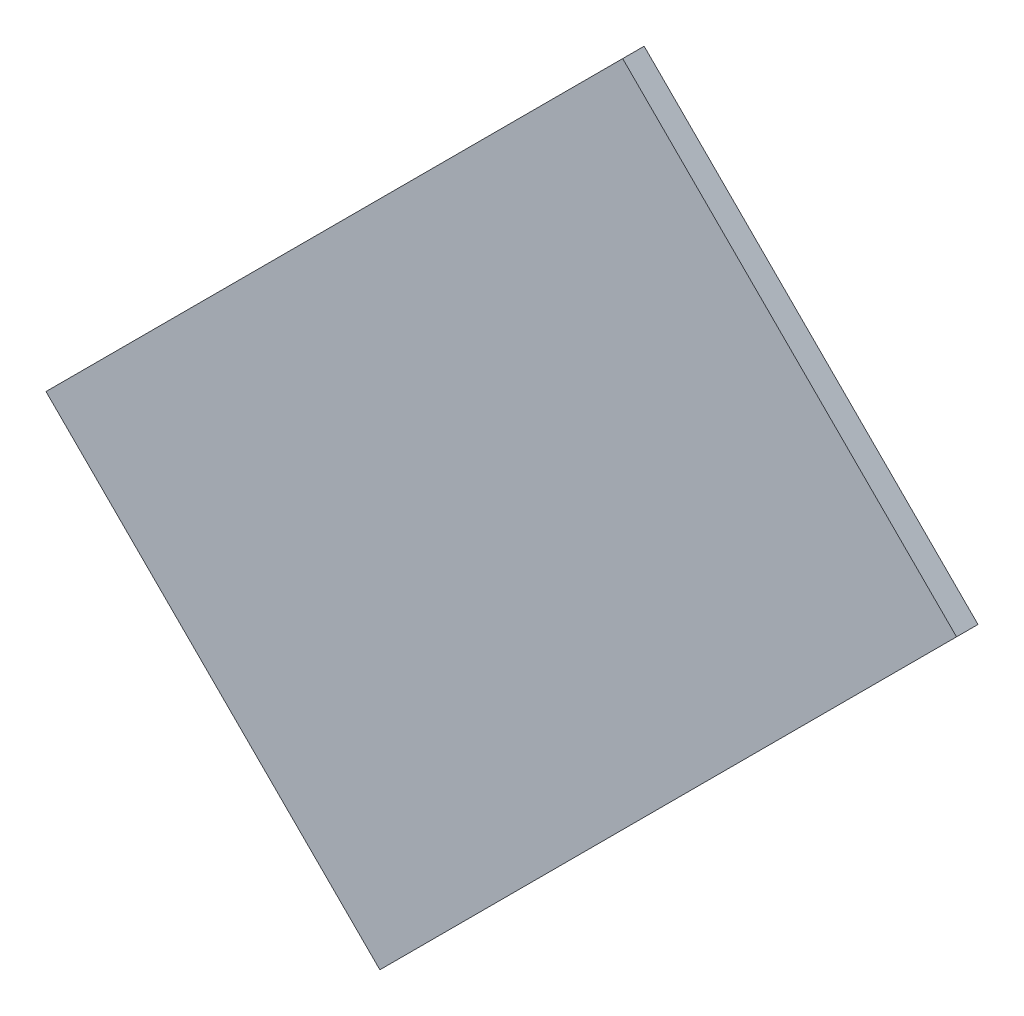
ISO-10303-21;
HEADER;
FILE_DESCRIPTION(('STEP AP214'),'2;1');
FILE_NAME('part.step','',(''),(''),'','','');
FILE_SCHEMA(('AUTOMOTIVE_DESIGN { 1 0 10303 214 1 1 1 1 }'));
ENDSEC;
DATA;
#1=APPLICATION_CONTEXT('core data for automotive mechanical design processes');
#2=APPLICATION_PROTOCOL_DEFINITION('international standard','automotive_design',2000,#1);
#3=PRODUCT_CONTEXT('',#1,'mechanical');
#4=PRODUCT('Part','Part','',(#3));
#5=PRODUCT_RELATED_PRODUCT_CATEGORY('part','',(#4));
#6=PRODUCT_DEFINITION_FORMATION('','',#4);
#7=PRODUCT_DEFINITION_CONTEXT('part definition',#1,'design');
#8=PRODUCT_DEFINITION('design','',#6,#7);
#9=PRODUCT_DEFINITION_SHAPE('','',#8);
#10=(LENGTH_UNIT() NAMED_UNIT(*) SI_UNIT(.MILLI.,.METRE.));
#11=(NAMED_UNIT(*) PLANE_ANGLE_UNIT() SI_UNIT($,.RADIAN.));
#12=(NAMED_UNIT(*) SI_UNIT($,.STERADIAN.) SOLID_ANGLE_UNIT());
#13=UNCERTAINTY_MEASURE_WITH_UNIT(LENGTH_MEASURE(1.E-05),#10,'distance_accuracy_value','');
#14=(GEOMETRIC_REPRESENTATION_CONTEXT(3) GLOBAL_UNCERTAINTY_ASSIGNED_CONTEXT((#13)) GLOBAL_UNIT_ASSIGNED_CONTEXT((#10,
#11,#12)) REPRESENTATION_CONTEXT('',''));
#15=CARTESIAN_POINT('',(0.,0.,0.));
#16=DIRECTION('',(0.,0.,1.));
#17=DIRECTION('',(1.,0.,0.));
#18=AXIS2_PLACEMENT_3D('',#15,#16,#17);
#19=CARTESIAN_POINT('',(3.53553390600398,704.808671689089,-336.857743681072));
#20=DIRECTION('',(0.,0.,1.));
#21=DIRECTION('',(1.,0.,0.));
#22=AXIS2_PLACEMENT_3D('',#19,#20,#21);
#23=PLANE('',#22);
#24=DIRECTION('',(0.707106781187497,0.707106781185598,0.));
#25=VECTOR('',#24,1.);
#26=CARTESIAN_POINT('',(-17.6776695296571,656.725410568432,-336.857743681072));
#27=LINE('',#26,#25);
#28=CARTESIAN_POINT('',(-17.6776695296571,656.725410568432,-336.857743681072));
#29=VERTEX_POINT('',#28);
#30=CARTESIAN_POINT('',(9.19238815546803,683.595468253485,-336.857743681072));
#31=VERTEX_POINT('',#30);
#32=EDGE_CURVE('E79',#29,#31,#27,.T.);
#33=ORIENTED_EDGE('',*,*,#32,.T.);
#34=DIRECTION('',(0.707106781185597,-0.707106781187498,0.));
#35=VECTOR('',#34,1.);
#36=CARTESIAN_POINT('',(9.19238815546795,683.595468253485,-336.857743681072));
#37=LINE('',#36,#35);
#38=CARTESIAN_POINT('',(24.748737341551,668.03911906736,-336.857743681072));
#39=VERTEX_POINT('',#38);
#40=EDGE_CURVE('E55',#31,#39,#37,.T.);
#41=ORIENTED_EDGE('',*,*,#40,.T.);
#42=DIRECTION('',(-0.707106781187499,-0.707106781185596,0.));
#43=VECTOR('',#42,1.);
#44=CARTESIAN_POINT('',(-2.12132034357409,641.169061382308,-336.857743681072));
#45=LINE('',#44,#43);
#46=CARTESIAN_POINT('',(-2.1213203435742,641.169061382308,-336.857743681072));
#47=VERTEX_POINT('',#46);
#48=EDGE_CURVE('E57',#39,#47,#45,.T.);
#49=ORIENTED_EDGE('',*,*,#48,.T.);
#50=DIRECTION('',(-0.707106781185598,0.707106781187497,0.));
#51=VECTOR('',#50,1.);
#52=CARTESIAN_POINT('',(-17.6776695296571,656.725410568432,-336.857743681072));
#53=LINE('',#52,#51);
#54=EDGE_CURVE('E20',#47,#29,#53,.T.);
#55=ORIENTED_EDGE('',*,*,#54,.T.);
#56=EDGE_LOOP('',(#33,#41,#49,#55));
#57=FACE_BOUND('',#56,.T.);
#58=ADVANCED_FACE('F17',(#57),#23,.F.);
#59=CARTESIAN_POINT('',(-17.6776695296571,656.725410568432,-336.857743681072));
#60=DIRECTION('',(0.707106781187497,0.707106781185598,0.));
#61=DIRECTION('',(-0.707106781185598,0.707106781187497,0.));
#62=AXIS2_PLACEMENT_3D('',#59,#60,#61);
#63=PLANE('',#62);
#64=DIRECTION('',(0.707106781185615,-0.70710678118748,0.));
#65=VECTOR('',#64,1.);
#66=CARTESIAN_POINT('',(-17.6776695296571,656.725410568432,-335.857743681072));
#67=LINE('',#66,#65);
#68=CARTESIAN_POINT('',(-17.6776695296571,656.725410568432,-335.857743681072));
#69=VERTEX_POINT('',#68);
#70=CARTESIAN_POINT('',(-2.1213203435743,641.169061382308,-335.857743681072));
#71=VERTEX_POINT('',#70);
#72=EDGE_CURVE('E83',#69,#71,#67,.T.);
#73=ORIENTED_EDGE('',*,*,#72,.F.);
#74=DIRECTION('',(0.,0.,1.));
#75=VECTOR('',#74,1.);
#76=CARTESIAN_POINT('',(-17.6776695296571,656.725410568432,-335.857743681072));
#77=LINE('',#76,#75);
#78=EDGE_CURVE('E68',#69,#29,#77,.F.);
#79=ORIENTED_EDGE('',*,*,#78,.T.);
#80=ORIENTED_EDGE('',*,*,#54,.F.);
#81=DIRECTION('',(0.,0.,1.));
#82=VECTOR('',#81,1.);
#83=CARTESIAN_POINT('',(-2.12132034357409,641.169061382308,-336.857743681072));
#84=LINE('',#83,#82);
#85=EDGE_CURVE('E63',#47,#71,#84,.T.);
#86=ORIENTED_EDGE('',*,*,#85,.T.);
#87=EDGE_LOOP('',(#73,#79,#80,#86));
#88=FACE_BOUND('',#87,.T.);
#89=ADVANCED_FACE('F65',(#88),#63,.F.);
#90=CARTESIAN_POINT('',(-2.12132034357409,641.169061382308,-336.857743681072));
#91=DIRECTION('',(-0.707106781185596,0.707106781187499,0.));
#92=DIRECTION('',(-0.707106781187499,-0.707106781185596,0.));
#93=AXIS2_PLACEMENT_3D('',#90,#91,#92);
#94=PLANE('',#93);
#95=DIRECTION('',(0.70710678118751,0.707106781185585,0.));
#96=VECTOR('',#95,1.);
#97=CARTESIAN_POINT('',(-2.1213203435741,641.169061382308,-335.857743681072));
#98=LINE('',#97,#96);
#99=CARTESIAN_POINT('',(24.7487373415509,668.03911906736,-335.857743681072));
#100=VERTEX_POINT('',#99);
#101=EDGE_CURVE('E72',#71,#100,#98,.T.);
#102=ORIENTED_EDGE('',*,*,#101,.F.);
#103=ORIENTED_EDGE('',*,*,#85,.F.);
#104=ORIENTED_EDGE('',*,*,#48,.F.);
#105=DIRECTION('',(0.,0.,1.));
#106=VECTOR('',#105,1.);
#107=CARTESIAN_POINT('',(24.7487373415511,668.03911906736,-335.857743681072));
#108=LINE('',#107,#106);
#109=EDGE_CURVE('E75',#39,#100,#108,.T.);
#110=ORIENTED_EDGE('',*,*,#109,.T.);
#111=EDGE_LOOP('',(#102,#103,#104,#110));
#112=FACE_BOUND('',#111,.T.);
#113=ADVANCED_FACE('F70',(#112),#94,.F.);
#114=CARTESIAN_POINT('',(9.19238815546795,683.595468253485,-335.857743681072));
#115=DIRECTION('',(-0.707106781187498,-0.707106781185597,0.));
#116=DIRECTION('',(0.707106781185597,-0.707106781187498,0.));
#117=AXIS2_PLACEMENT_3D('',#114,#115,#116);
#118=PLANE('',#117);
#119=DIRECTION('',(-0.707106781185593,0.707106781187502,0.));
#120=VECTOR('',#119,1.);
#121=CARTESIAN_POINT('',(24.7487373415511,668.03911906736,-335.857743681072));
#122=LINE('',#121,#120);
#123=CARTESIAN_POINT('',(9.19238815546801,683.595468253485,-335.857743681072));
#124=VERTEX_POINT('',#123);
#125=EDGE_CURVE('E26',#100,#124,#122,.T.);
#126=ORIENTED_EDGE('',*,*,#125,.F.);
#127=ORIENTED_EDGE('',*,*,#109,.F.);
#128=ORIENTED_EDGE('',*,*,#40,.F.);
#129=DIRECTION('',(0.,0.,1.));
#130=VECTOR('',#129,1.);
#131=CARTESIAN_POINT('',(9.19238815546807,683.595468253485,-335.857743681072));
#132=LINE('',#131,#130);
#133=EDGE_CURVE('E35',#31,#124,#132,.T.);
#134=ORIENTED_EDGE('',*,*,#133,.T.);
#135=EDGE_LOOP('',(#126,#127,#128,#134));
#136=FACE_BOUND('',#135,.T.);
#137=ADVANCED_FACE('F89',(#136),#118,.F.);
#138=CARTESIAN_POINT('',(-17.6776695296571,656.725410568432,-335.857743681072));
#139=DIRECTION('',(0.707106781185598,-0.707106781187497,0.));
#140=DIRECTION('',(0.707106781187497,0.707106781185598,0.));
#141=AXIS2_PLACEMENT_3D('',#138,#139,#140);
#142=PLANE('',#141);
#143=DIRECTION('',(-0.707106781187497,-0.707106781185598,0.));
#144=VECTOR('',#143,1.);
#145=CARTESIAN_POINT('',(9.19238815546805,683.595468253485,-335.857743681072));
#146=LINE('',#145,#144);
#147=EDGE_CURVE('E11',#124,#69,#146,.T.);
#148=ORIENTED_EDGE('',*,*,#147,.F.);
#149=ORIENTED_EDGE('',*,*,#133,.F.);
#150=ORIENTED_EDGE('',*,*,#32,.F.);
#151=ORIENTED_EDGE('',*,*,#78,.F.);
#152=EDGE_LOOP('',(#148,#149,#150,#151));
#153=FACE_BOUND('',#152,.T.);
#154=ADVANCED_FACE('F91',(#153),#142,.F.);
#155=CARTESIAN_POINT('',(3.53553390600398,704.808671689089,-335.857743681072));
#156=DIRECTION('',(0.,0.,1.));
#157=DIRECTION('',(1.,0.,0.));
#158=AXIS2_PLACEMENT_3D('',#155,#156,#157);
#159=PLANE('',#158);
#160=ORIENTED_EDGE('',*,*,#125,.T.);
#161=ORIENTED_EDGE('',*,*,#147,.T.);
#162=ORIENTED_EDGE('',*,*,#72,.T.);
#163=ORIENTED_EDGE('',*,*,#101,.T.);
#164=EDGE_LOOP('',(#160,#161,#162,#163));
#165=FACE_BOUND('',#164,.T.);
#166=ADVANCED_FACE('F88',(#165),#159,.T.);
#167=CLOSED_SHELL('',(#58,#89,#113,#137,#154,#166));
#168=MANIFOLD_SOLID_BREP('B1',#167);
#169=ADVANCED_BREP_SHAPE_REPRESENTATION('',(#18,#168),#14);
#170=SHAPE_DEFINITION_REPRESENTATION(#9,#169);
ENDSEC;
END-ISO-10303-21;
